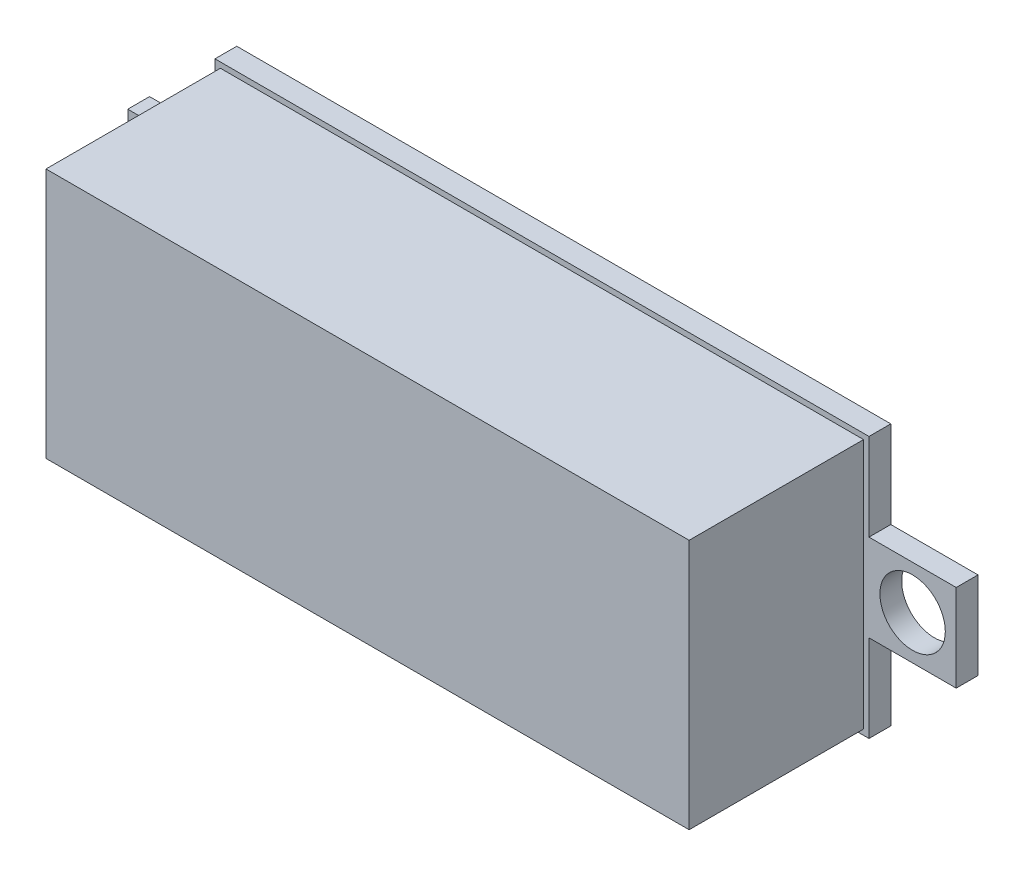
ISO-10303-21;
HEADER;
FILE_DESCRIPTION(('STEP AP214'),'2;1');
FILE_NAME('part.step','',(''),(''),'','','');
FILE_SCHEMA(('AUTOMOTIVE_DESIGN { 1 0 10303 214 1 1 1 1 }'));
ENDSEC;
DATA;
#1=APPLICATION_CONTEXT('core data for automotive mechanical design processes');
#2=APPLICATION_PROTOCOL_DEFINITION('international standard','automotive_design',2000,#1);
#3=PRODUCT_CONTEXT('',#1,'mechanical');
#4=PRODUCT('Part','Part','',(#3));
#5=PRODUCT_RELATED_PRODUCT_CATEGORY('part','',(#4));
#6=PRODUCT_DEFINITION_FORMATION('','',#4);
#7=PRODUCT_DEFINITION_CONTEXT('part definition',#1,'design');
#8=PRODUCT_DEFINITION('design','',#6,#7);
#9=PRODUCT_DEFINITION_SHAPE('','',#8);
#10=(LENGTH_UNIT() NAMED_UNIT(*) SI_UNIT(.MILLI.,.METRE.));
#11=(NAMED_UNIT(*) PLANE_ANGLE_UNIT() SI_UNIT($,.RADIAN.));
#12=(NAMED_UNIT(*) SI_UNIT($,.STERADIAN.) SOLID_ANGLE_UNIT());
#13=UNCERTAINTY_MEASURE_WITH_UNIT(LENGTH_MEASURE(1.E-05),#10,'distance_accuracy_value','');
#14=(GEOMETRIC_REPRESENTATION_CONTEXT(3) GLOBAL_UNCERTAINTY_ASSIGNED_CONTEXT((#13)) GLOBAL_UNIT_ASSIGNED_CONTEXT((#10,
#11,#12)) REPRESENTATION_CONTEXT('',''));
#15=CARTESIAN_POINT('',(0.,0.,0.));
#16=DIRECTION('',(0.,0.,1.));
#17=DIRECTION('',(1.,0.,0.));
#18=AXIS2_PLACEMENT_3D('',#15,#16,#17);
#19=CARTESIAN_POINT('',(0.,0.,1.));
#20=DIRECTION('',(0.,0.,1.));
#21=DIRECTION('',(1.,0.,0.));
#22=AXIS2_PLACEMENT_3D('',#19,#20,#21);
#23=PLANE('',#22);
#24=CARTESIAN_POINT('',(-2.,6.,1.));
#25=DIRECTION('',(0.,0.,1.));
#26=DIRECTION('',(1.,0.,0.));
#27=AXIS2_PLACEMENT_3D('',#24,#25,#26);
#28=CIRCLE('',#27,1.5);
#29=CARTESIAN_POINT('',(-0.499999999999998,6.,1.));
#30=VERTEX_POINT('',#29);
#31=EDGE_CURVE('E215',#30,#30,#28,.T.);
#32=ORIENTED_EDGE('',*,*,#31,.F.);
#33=EDGE_LOOP('',(#32));
#34=FACE_BOUND('',#33,.T.);
#35=DIRECTION('',(0.,-1.,0.));
#36=VECTOR('',#35,1.);
#37=CARTESIAN_POINT('',(-4.,0.,1.));
#38=LINE('',#37,#36);
#39=CARTESIAN_POINT('',(-4.,8.,1.));
#40=VERTEX_POINT('',#39);
#41=CARTESIAN_POINT('',(-4.,4.,1.));
#42=VERTEX_POINT('',#41);
#43=EDGE_CURVE('E268',#40,#42,#38,.T.);
#44=ORIENTED_EDGE('',*,*,#43,.T.);
#45=DIRECTION('',(1.,0.,0.));
#46=VECTOR('',#45,1.);
#47=CARTESIAN_POINT('',(0.,4.,1.));
#48=LINE('',#47,#46);
#49=CARTESIAN_POINT('',(0.,4.,1.));
#50=VERTEX_POINT('',#49);
#51=EDGE_CURVE('E113',#42,#50,#48,.T.);
#52=ORIENTED_EDGE('',*,*,#51,.T.);
#53=DIRECTION('',(0.,-1.,0.));
#54=VECTOR('',#53,1.);
#55=CARTESIAN_POINT('',(0.,0.,1.));
#56=LINE('',#55,#54);
#57=CARTESIAN_POINT('',(0.,0.,1.));
#58=VERTEX_POINT('',#57);
#59=EDGE_CURVE('E164',#50,#58,#56,.T.);
#60=ORIENTED_EDGE('',*,*,#59,.T.);
#61=DIRECTION('',(1.,0.,0.));
#62=VECTOR('',#61,1.);
#63=CARTESIAN_POINT('',(0.,0.,1.));
#64=LINE('',#63,#62);
#65=CARTESIAN_POINT('',(30.,0.,1.));
#66=VERTEX_POINT('',#65);
#67=EDGE_CURVE('E248',#58,#66,#64,.T.);
#68=ORIENTED_EDGE('',*,*,#67,.T.);
#69=DIRECTION('',(0.,-1.,0.));
#70=VECTOR('',#69,1.);
#71=CARTESIAN_POINT('',(30.,0.,1.));
#72=LINE('',#71,#70);
#73=CARTESIAN_POINT('',(30.,4.,1.));
#74=VERTEX_POINT('',#73);
#75=EDGE_CURVE('E173',#74,#66,#72,.T.);
#76=ORIENTED_EDGE('',*,*,#75,.F.);
#77=DIRECTION('',(1.,0.,0.));
#78=VECTOR('',#77,1.);
#79=CARTESIAN_POINT('',(0.,4.,1.));
#80=LINE('',#79,#78);
#81=CARTESIAN_POINT('',(34.,4.,1.));
#82=VERTEX_POINT('',#81);
#83=EDGE_CURVE('E251',#74,#82,#80,.T.);
#84=ORIENTED_EDGE('',*,*,#83,.T.);
#85=DIRECTION('',(0.,-1.,0.));
#86=VECTOR('',#85,1.);
#87=CARTESIAN_POINT('',(34.,0.,1.));
#88=LINE('',#87,#86);
#89=CARTESIAN_POINT('',(34.,8.,1.));
#90=VERTEX_POINT('',#89);
#91=EDGE_CURVE('E254',#90,#82,#88,.T.);
#92=ORIENTED_EDGE('',*,*,#91,.F.);
#93=DIRECTION('',(1.,0.,0.));
#94=VECTOR('',#93,1.);
#95=CARTESIAN_POINT('',(0.,8.,1.));
#96=LINE('',#95,#94);
#97=CARTESIAN_POINT('',(30.,8.,1.));
#98=VERTEX_POINT('',#97);
#99=EDGE_CURVE('E171',#98,#90,#96,.T.);
#100=ORIENTED_EDGE('',*,*,#99,.F.);
#101=CARTESIAN_POINT('',(30.,12.,1.));
#102=VERTEX_POINT('',#101);
#103=EDGE_CURVE('E169',#102,#98,#72,.T.);
#104=ORIENTED_EDGE('',*,*,#103,.F.);
#105=DIRECTION('',(1.,0.,0.));
#106=VECTOR('',#105,1.);
#107=CARTESIAN_POINT('',(0.,12.,1.));
#108=LINE('',#107,#106);
#109=CARTESIAN_POINT('',(0.,12.,1.));
#110=VERTEX_POINT('',#109);
#111=EDGE_CURVE('E148',#110,#102,#108,.T.);
#112=ORIENTED_EDGE('',*,*,#111,.F.);
#113=CARTESIAN_POINT('',(0.,8.,1.));
#114=VERTEX_POINT('',#113);
#115=EDGE_CURVE('E158',#110,#114,#56,.T.);
#116=ORIENTED_EDGE('',*,*,#115,.T.);
#117=DIRECTION('',(1.,0.,0.));
#118=VECTOR('',#117,1.);
#119=CARTESIAN_POINT('',(0.,8.,1.));
#120=LINE('',#119,#118);
#121=EDGE_CURVE('E162',#40,#114,#120,.T.);
#122=ORIENTED_EDGE('',*,*,#121,.F.);
#123=EDGE_LOOP('',(#44,#52,#60,#68,#76,#84,#92,#100,#104,#112,#116,#122));
#124=FACE_BOUND('',#123,.T.);
#125=CARTESIAN_POINT('',(32.,6.,1.));
#126=DIRECTION('',(0.,0.,1.));
#127=DIRECTION('',(1.,0.,0.));
#128=AXIS2_PLACEMENT_3D('',#125,#126,#127);
#129=CIRCLE('',#128,1.5);
#130=CARTESIAN_POINT('',(33.5,6.,1.));
#131=VERTEX_POINT('',#130);
#132=EDGE_CURVE('E178',#131,#131,#129,.T.);
#133=ORIENTED_EDGE('',*,*,#132,.F.);
#134=EDGE_LOOP('',(#133));
#135=FACE_BOUND('',#134,.T.);
#136=DIRECTION('',(1.,0.,0.));
#137=VECTOR('',#136,1.);
#138=CARTESIAN_POINT('',(0.250000000000001,0.25,1.));
#139=LINE('',#138,#137);
#140=CARTESIAN_POINT('',(0.250000000000001,0.25,1.));
#141=VERTEX_POINT('',#140);
#142=CARTESIAN_POINT('',(29.75,0.25,1.));
#143=VERTEX_POINT('',#142);
#144=EDGE_CURVE('E565',#141,#143,#139,.T.);
#145=ORIENTED_EDGE('',*,*,#144,.F.);
#146=DIRECTION('',(0.,-1.,0.));
#147=VECTOR('',#146,1.);
#148=CARTESIAN_POINT('',(0.25,11.75,1.));
#149=LINE('',#148,#147);
#150=CARTESIAN_POINT('',(0.25,11.75,1.));
#151=VERTEX_POINT('',#150);
#152=EDGE_CURVE('E547',#151,#141,#149,.T.);
#153=ORIENTED_EDGE('',*,*,#152,.F.);
#154=DIRECTION('',(-1.,0.,0.));
#155=VECTOR('',#154,1.);
#156=CARTESIAN_POINT('',(0.25,11.75,1.));
#157=LINE('',#156,#155);
#158=CARTESIAN_POINT('',(29.75,11.75,1.));
#159=VERTEX_POINT('',#158);
#160=EDGE_CURVE('E541',#159,#151,#157,.T.);
#161=ORIENTED_EDGE('',*,*,#160,.F.);
#162=DIRECTION('',(0.,1.,0.));
#163=VECTOR('',#162,1.);
#164=CARTESIAN_POINT('',(29.75,11.75,1.));
#165=LINE('',#164,#163);
#166=EDGE_CURVE('E563',#143,#159,#165,.T.);
#167=ORIENTED_EDGE('',*,*,#166,.F.);
#168=EDGE_LOOP('',(#145,#153,#161,#167));
#169=FACE_BOUND('',#168,.T.);
#170=ADVANCED_FACE('F38',(#34,#124,#135,#169),#23,.T.);
#171=CARTESIAN_POINT('',(-4.,0.,1.));
#172=DIRECTION('',(1.,0.,0.));
#173=DIRECTION('',(0.,0.,-1.));
#174=AXIS2_PLACEMENT_3D('',#171,#172,#173);
#175=PLANE('',#174);
#176=DIRECTION('',(0.,-1.,0.));
#177=VECTOR('',#176,1.);
#178=CARTESIAN_POINT('',(-4.,0.,0.));
#179=LINE('',#178,#177);
#180=CARTESIAN_POINT('',(-4.,8.,0.));
#181=VERTEX_POINT('',#180);
#182=CARTESIAN_POINT('',(-4.,4.,0.));
#183=VERTEX_POINT('',#182);
#184=EDGE_CURVE('E184',#181,#183,#179,.T.);
#185=ORIENTED_EDGE('',*,*,#184,.T.);
#186=DIRECTION('',(0.,0.,-1.));
#187=VECTOR('',#186,1.);
#188=CARTESIAN_POINT('',(-4.,4.,1.));
#189=LINE('',#188,#187);
#190=EDGE_CURVE('E11',#42,#183,#189,.T.);
#191=ORIENTED_EDGE('',*,*,#190,.F.);
#192=ORIENTED_EDGE('',*,*,#43,.F.);
#193=DIRECTION('',(0.,0.,-1.));
#194=VECTOR('',#193,1.);
#195=CARTESIAN_POINT('',(-4.,8.,1.));
#196=LINE('',#195,#194);
#197=EDGE_CURVE('E62',#40,#181,#196,.T.);
#198=ORIENTED_EDGE('',*,*,#197,.T.);
#199=EDGE_LOOP('',(#185,#191,#192,#198));
#200=FACE_BOUND('',#199,.T.);
#201=ADVANCED_FACE('F271',(#200),#175,.F.);
#202=CARTESIAN_POINT('',(0.,4.,1.));
#203=DIRECTION('',(0.,1.,0.));
#204=DIRECTION('',(0.,0.,1.));
#205=AXIS2_PLACEMENT_3D('',#202,#203,#204);
#206=PLANE('',#205);
#207=DIRECTION('',(1.,0.,0.));
#208=VECTOR('',#207,1.);
#209=CARTESIAN_POINT('',(0.,4.,0.));
#210=LINE('',#209,#208);
#211=CARTESIAN_POINT('',(0.,4.,0.));
#212=VERTEX_POINT('',#211);
#213=EDGE_CURVE('E187',#183,#212,#210,.T.);
#214=ORIENTED_EDGE('',*,*,#213,.T.);
#215=DIRECTION('',(0.,0.,-1.));
#216=VECTOR('',#215,1.);
#217=CARTESIAN_POINT('',(0.,4.,1.));
#218=LINE('',#217,#216);
#219=EDGE_CURVE('E46',#50,#212,#218,.T.);
#220=ORIENTED_EDGE('',*,*,#219,.F.);
#221=ORIENTED_EDGE('',*,*,#51,.F.);
#222=ORIENTED_EDGE('',*,*,#190,.T.);
#223=EDGE_LOOP('',(#214,#220,#221,#222));
#224=FACE_BOUND('',#223,.T.);
#225=ADVANCED_FACE('F272',(#224),#206,.F.);
#226=CARTESIAN_POINT('',(0.,0.,1.));
#227=DIRECTION('',(1.,0.,0.));
#228=DIRECTION('',(0.,0.,-1.));
#229=AXIS2_PLACEMENT_3D('',#226,#227,#228);
#230=PLANE('',#229);
#231=DIRECTION('',(0.,-1.,0.));
#232=VECTOR('',#231,1.);
#233=CARTESIAN_POINT('',(0.,0.,0.));
#234=LINE('',#233,#232);
#235=CARTESIAN_POINT('',(0.,0.,0.));
#236=VERTEX_POINT('',#235);
#237=EDGE_CURVE('E189',#212,#236,#234,.T.);
#238=ORIENTED_EDGE('',*,*,#237,.T.);
#239=DIRECTION('',(0.,0.,-1.));
#240=VECTOR('',#239,1.);
#241=CARTESIAN_POINT('',(0.,0.,1.));
#242=LINE('',#241,#240);
#243=EDGE_CURVE('E229',#58,#236,#242,.T.);
#244=ORIENTED_EDGE('',*,*,#243,.F.);
#245=ORIENTED_EDGE('',*,*,#59,.F.);
#246=ORIENTED_EDGE('',*,*,#219,.T.);
#247=EDGE_LOOP('',(#238,#244,#245,#246));
#248=FACE_BOUND('',#247,.T.);
#249=ADVANCED_FACE('F235',(#248),#230,.F.);
#250=CARTESIAN_POINT('',(0.,0.,1.));
#251=DIRECTION('',(0.,1.,0.));
#252=DIRECTION('',(0.,0.,1.));
#253=AXIS2_PLACEMENT_3D('',#250,#251,#252);
#254=PLANE('',#253);
#255=DIRECTION('',(1.,0.,0.));
#256=VECTOR('',#255,1.);
#257=CARTESIAN_POINT('',(0.,0.,0.));
#258=LINE('',#257,#256);
#259=CARTESIAN_POINT('',(30.,0.,0.));
#260=VERTEX_POINT('',#259);
#261=EDGE_CURVE('E191',#236,#260,#258,.T.);
#262=ORIENTED_EDGE('',*,*,#261,.T.);
#263=DIRECTION('',(0.,0.,-1.));
#264=VECTOR('',#263,1.);
#265=CARTESIAN_POINT('',(30.,0.,1.));
#266=LINE('',#265,#264);
#267=EDGE_CURVE('E227',#66,#260,#266,.T.);
#268=ORIENTED_EDGE('',*,*,#267,.F.);
#269=ORIENTED_EDGE('',*,*,#67,.F.);
#270=ORIENTED_EDGE('',*,*,#243,.T.);
#271=EDGE_LOOP('',(#262,#268,#269,#270));
#272=FACE_BOUND('',#271,.T.);
#273=ADVANCED_FACE('F245',(#272),#254,.F.);
#274=CARTESIAN_POINT('',(30.,0.,1.));
#275=DIRECTION('',(1.,0.,0.));
#276=DIRECTION('',(0.,0.,-1.));
#277=AXIS2_PLACEMENT_3D('',#274,#275,#276);
#278=PLANE('',#277);
#279=DIRECTION('',(0.,-1.,0.));
#280=VECTOR('',#279,1.);
#281=CARTESIAN_POINT('',(30.,0.,0.));
#282=LINE('',#281,#280);
#283=CARTESIAN_POINT('',(30.,4.,0.));
#284=VERTEX_POINT('',#283);
#285=EDGE_CURVE('E195',#284,#260,#282,.T.);
#286=ORIENTED_EDGE('',*,*,#285,.F.);
#287=DIRECTION('',(0.,0.,-1.));
#288=VECTOR('',#287,1.);
#289=CARTESIAN_POINT('',(30.,4.,1.));
#290=LINE('',#289,#288);
#291=EDGE_CURVE('E225',#74,#284,#290,.T.);
#292=ORIENTED_EDGE('',*,*,#291,.F.);
#293=ORIENTED_EDGE('',*,*,#75,.T.);
#294=ORIENTED_EDGE('',*,*,#267,.T.);
#295=EDGE_LOOP('',(#286,#292,#293,#294));
#296=FACE_BOUND('',#295,.T.);
#297=ADVANCED_FACE('F305',(#296),#278,.T.);
#298=CARTESIAN_POINT('',(0.,4.,1.));
#299=DIRECTION('',(0.,1.,0.));
#300=DIRECTION('',(0.,0.,1.));
#301=AXIS2_PLACEMENT_3D('',#298,#299,#300);
#302=PLANE('',#301);
#303=DIRECTION('',(1.,0.,0.));
#304=VECTOR('',#303,1.);
#305=CARTESIAN_POINT('',(0.,4.,0.));
#306=LINE('',#305,#304);
#307=CARTESIAN_POINT('',(34.,4.,0.));
#308=VERTEX_POINT('',#307);
#309=EDGE_CURVE('E198',#284,#308,#306,.T.);
#310=ORIENTED_EDGE('',*,*,#309,.T.);
#311=DIRECTION('',(0.,0.,-1.));
#312=VECTOR('',#311,1.);
#313=CARTESIAN_POINT('',(34.,4.,1.));
#314=LINE('',#313,#312);
#315=EDGE_CURVE('E223',#82,#308,#314,.T.);
#316=ORIENTED_EDGE('',*,*,#315,.F.);
#317=ORIENTED_EDGE('',*,*,#83,.F.);
#318=ORIENTED_EDGE('',*,*,#291,.T.);
#319=EDGE_LOOP('',(#310,#316,#317,#318));
#320=FACE_BOUND('',#319,.T.);
#321=ADVANCED_FACE('F311',(#320),#302,.F.);
#322=CARTESIAN_POINT('',(34.,0.,1.));
#323=DIRECTION('',(1.,0.,0.));
#324=DIRECTION('',(0.,0.,-1.));
#325=AXIS2_PLACEMENT_3D('',#322,#323,#324);
#326=PLANE('',#325);
#327=DIRECTION('',(0.,-1.,0.));
#328=VECTOR('',#327,1.);
#329=CARTESIAN_POINT('',(34.,0.,0.));
#330=LINE('',#329,#328);
#331=CARTESIAN_POINT('',(34.,8.,0.));
#332=VERTEX_POINT('',#331);
#333=EDGE_CURVE('E202',#332,#308,#330,.T.);
#334=ORIENTED_EDGE('',*,*,#333,.F.);
#335=DIRECTION('',(0.,0.,-1.));
#336=VECTOR('',#335,1.);
#337=CARTESIAN_POINT('',(34.,8.,1.));
#338=LINE('',#337,#336);
#339=EDGE_CURVE('E221',#90,#332,#338,.T.);
#340=ORIENTED_EDGE('',*,*,#339,.F.);
#341=ORIENTED_EDGE('',*,*,#91,.T.);
#342=ORIENTED_EDGE('',*,*,#315,.T.);
#343=EDGE_LOOP('',(#334,#340,#341,#342));
#344=FACE_BOUND('',#343,.T.);
#345=ADVANCED_FACE('F308',(#344),#326,.T.);
#346=CARTESIAN_POINT('',(0.,8.,1.));
#347=DIRECTION('',(0.,1.,0.));
#348=DIRECTION('',(0.,0.,1.));
#349=AXIS2_PLACEMENT_3D('',#346,#347,#348);
#350=PLANE('',#349);
#351=DIRECTION('',(1.,0.,0.));
#352=VECTOR('',#351,1.);
#353=CARTESIAN_POINT('',(0.,8.,0.));
#354=LINE('',#353,#352);
#355=CARTESIAN_POINT('',(30.,8.,0.));
#356=VERTEX_POINT('',#355);
#357=EDGE_CURVE('E205',#356,#332,#354,.T.);
#358=ORIENTED_EDGE('',*,*,#357,.F.);
#359=DIRECTION('',(0.,0.,-1.));
#360=VECTOR('',#359,1.);
#361=CARTESIAN_POINT('',(30.,8.,1.));
#362=LINE('',#361,#360);
#363=EDGE_CURVE('E219',#98,#356,#362,.T.);
#364=ORIENTED_EDGE('',*,*,#363,.F.);
#365=ORIENTED_EDGE('',*,*,#99,.T.);
#366=ORIENTED_EDGE('',*,*,#339,.T.);
#367=EDGE_LOOP('',(#358,#364,#365,#366));
#368=FACE_BOUND('',#367,.T.);
#369=ADVANCED_FACE('F261',(#368),#350,.T.);
#370=CARTESIAN_POINT('',(30.,12.,0.));
#371=VERTEX_POINT('',#370);
#372=EDGE_CURVE('E199',#371,#356,#282,.T.);
#373=ORIENTED_EDGE('',*,*,#372,.F.);
#374=DIRECTION('',(0.,0.,-1.));
#375=VECTOR('',#374,1.);
#376=CARTESIAN_POINT('',(30.,12.,1.));
#377=LINE('',#376,#375);
#378=EDGE_CURVE('E154',#102,#371,#377,.T.);
#379=ORIENTED_EDGE('',*,*,#378,.F.);
#380=ORIENTED_EDGE('',*,*,#103,.T.);
#381=ORIENTED_EDGE('',*,*,#363,.T.);
#382=EDGE_LOOP('',(#373,#379,#380,#381));
#383=FACE_BOUND('',#382,.T.);
#384=ADVANCED_FACE('F265',(#383),#278,.T.);
#385=CARTESIAN_POINT('',(0.,12.,1.));
#386=DIRECTION('',(0.,1.,0.));
#387=DIRECTION('',(0.,0.,1.));
#388=AXIS2_PLACEMENT_3D('',#385,#386,#387);
#389=PLANE('',#388);
#390=DIRECTION('',(1.,0.,0.));
#391=VECTOR('',#390,1.);
#392=CARTESIAN_POINT('',(0.,12.,0.));
#393=LINE('',#392,#391);
#394=CARTESIAN_POINT('',(0.,12.,0.));
#395=VERTEX_POINT('',#394);
#396=EDGE_CURVE('E150',#395,#371,#393,.T.);
#397=ORIENTED_EDGE('',*,*,#396,.F.);
#398=DIRECTION('',(0.,0.,-1.));
#399=VECTOR('',#398,1.);
#400=CARTESIAN_POINT('',(0.,12.,1.));
#401=LINE('',#400,#399);
#402=EDGE_CURVE('E144',#110,#395,#401,.T.);
#403=ORIENTED_EDGE('',*,*,#402,.F.);
#404=ORIENTED_EDGE('',*,*,#111,.T.);
#405=ORIENTED_EDGE('',*,*,#378,.T.);
#406=EDGE_LOOP('',(#397,#403,#404,#405));
#407=FACE_BOUND('',#406,.T.);
#408=ADVANCED_FACE('F146',(#407),#389,.T.);
#409=CARTESIAN_POINT('',(0.,8.,0.));
#410=VERTEX_POINT('',#409);
#411=EDGE_CURVE('E192',#395,#410,#234,.T.);
#412=ORIENTED_EDGE('',*,*,#411,.T.);
#413=DIRECTION('',(0.,0.,-1.));
#414=VECTOR('',#413,1.);
#415=CARTESIAN_POINT('',(0.,8.,1.));
#416=LINE('',#415,#414);
#417=EDGE_CURVE('E155',#114,#410,#416,.T.);
#418=ORIENTED_EDGE('',*,*,#417,.F.);
#419=ORIENTED_EDGE('',*,*,#115,.F.);
#420=ORIENTED_EDGE('',*,*,#402,.T.);
#421=EDGE_LOOP('',(#412,#418,#419,#420));
#422=FACE_BOUND('',#421,.T.);
#423=ADVANCED_FACE('F159',(#422),#230,.F.);
#424=CARTESIAN_POINT('',(0.,8.,1.));
#425=DIRECTION('',(0.,1.,0.));
#426=DIRECTION('',(0.,0.,1.));
#427=AXIS2_PLACEMENT_3D('',#424,#425,#426);
#428=PLANE('',#427);
#429=DIRECTION('',(1.,0.,0.));
#430=VECTOR('',#429,1.);
#431=CARTESIAN_POINT('',(0.,8.,0.));
#432=LINE('',#431,#430);
#433=EDGE_CURVE('E209',#181,#410,#432,.T.);
#434=ORIENTED_EDGE('',*,*,#433,.F.);
#435=ORIENTED_EDGE('',*,*,#197,.F.);
#436=ORIENTED_EDGE('',*,*,#121,.T.);
#437=ORIENTED_EDGE('',*,*,#417,.T.);
#438=EDGE_LOOP('',(#434,#435,#436,#437));
#439=FACE_BOUND('',#438,.T.);
#440=ADVANCED_FACE('F267',(#439),#428,.T.);
#441=CARTESIAN_POINT('',(-2.,6.,1.));
#442=DIRECTION('',(0.,0.,-1.));
#443=DIRECTION('',(-1.,0.,0.));
#444=AXIS2_PLACEMENT_3D('',#441,#442,#443);
#445=CYLINDRICAL_SURFACE('',#444,1.5);
#446=ORIENTED_EDGE('',*,*,#31,.T.);
#447=EDGE_LOOP('',(#446));
#448=FACE_BOUND('',#447,.T.);
#449=CARTESIAN_POINT('',(-2.,6.,0.));
#450=DIRECTION('',(0.,0.,1.));
#451=DIRECTION('',(1.,0.,0.));
#452=AXIS2_PLACEMENT_3D('',#449,#450,#451);
#453=CIRCLE('',#452,1.5);
#454=CARTESIAN_POINT('',(-0.499999999999998,6.,0.));
#455=VERTEX_POINT('',#454);
#456=EDGE_CURVE('E181',#455,#455,#453,.T.);
#457=ORIENTED_EDGE('',*,*,#456,.F.);
#458=EDGE_LOOP('',(#457));
#459=FACE_BOUND('',#458,.T.);
#460=ADVANCED_FACE('F40',(#448,#459),#445,.F.);
#461=CARTESIAN_POINT('',(32.,6.,1.));
#462=DIRECTION('',(0.,0.,-1.));
#463=DIRECTION('',(-1.,0.,0.));
#464=AXIS2_PLACEMENT_3D('',#461,#462,#463);
#465=CYLINDRICAL_SURFACE('',#464,1.5);
#466=ORIENTED_EDGE('',*,*,#132,.T.);
#467=EDGE_LOOP('',(#466));
#468=FACE_BOUND('',#467,.T.);
#469=CARTESIAN_POINT('',(32.,6.,0.));
#470=DIRECTION('',(0.,0.,1.));
#471=DIRECTION('',(1.,0.,0.));
#472=AXIS2_PLACEMENT_3D('',#469,#470,#471);
#473=CIRCLE('',#472,1.5);
#474=CARTESIAN_POINT('',(33.5,6.,0.));
#475=VERTEX_POINT('',#474);
#476=EDGE_CURVE('E212',#475,#475,#473,.T.);
#477=ORIENTED_EDGE('',*,*,#476,.F.);
#478=EDGE_LOOP('',(#477));
#479=FACE_BOUND('',#478,.T.);
#480=ADVANCED_FACE('F293',(#468,#479),#465,.F.);
#481=CARTESIAN_POINT('',(0.,0.,0.));
#482=DIRECTION('',(0.,0.,1.));
#483=DIRECTION('',(1.,0.,0.));
#484=AXIS2_PLACEMENT_3D('',#481,#482,#483);
#485=PLANE('',#484);
#486=ORIENTED_EDGE('',*,*,#456,.T.);
#487=EDGE_LOOP('',(#486));
#488=FACE_BOUND('',#487,.T.);
#489=ORIENTED_EDGE('',*,*,#184,.F.);
#490=ORIENTED_EDGE('',*,*,#433,.T.);
#491=ORIENTED_EDGE('',*,*,#411,.F.);
#492=ORIENTED_EDGE('',*,*,#396,.T.);
#493=ORIENTED_EDGE('',*,*,#372,.T.);
#494=ORIENTED_EDGE('',*,*,#357,.T.);
#495=ORIENTED_EDGE('',*,*,#333,.T.);
#496=ORIENTED_EDGE('',*,*,#309,.F.);
#497=ORIENTED_EDGE('',*,*,#285,.T.);
#498=ORIENTED_EDGE('',*,*,#261,.F.);
#499=ORIENTED_EDGE('',*,*,#237,.F.);
#500=ORIENTED_EDGE('',*,*,#213,.F.);
#501=EDGE_LOOP('',(#489,#490,#491,#492,#493,#494,#495,#496,#497,#498,#499,#500));
#502=FACE_BOUND('',#501,.T.);
#503=ORIENTED_EDGE('',*,*,#476,.T.);
#504=EDGE_LOOP('',(#503));
#505=FACE_BOUND('',#504,.T.);
#506=ADVANCED_FACE('F239',(#488,#502,#505),#485,.F.);
#507=CARTESIAN_POINT('',(0.25,11.75,9.));
#508=DIRECTION('',(1.,0.,0.));
#509=DIRECTION('',(0.,1.,0.));
#510=AXIS2_PLACEMENT_3D('',#507,#508,#509);
#511=PLANE('',#510);
#512=ORIENTED_EDGE('',*,*,#152,.T.);
#513=DIRECTION('',(0.,0.,-1.));
#514=VECTOR('',#513,1.);
#515=CARTESIAN_POINT('',(0.250000000000001,0.25,9.));
#516=LINE('',#515,#514);
#517=CARTESIAN_POINT('',(0.250000000000001,0.25,9.));
#518=VERTEX_POINT('',#517);
#519=EDGE_CURVE('E185',#518,#141,#516,.T.);
#520=ORIENTED_EDGE('',*,*,#519,.F.);
#521=DIRECTION('',(0.,-1.,0.));
#522=VECTOR('',#521,1.);
#523=CARTESIAN_POINT('',(0.25,11.75,9.));
#524=LINE('',#523,#522);
#525=CARTESIAN_POINT('',(0.25,11.75,9.));
#526=VERTEX_POINT('',#525);
#527=EDGE_CURVE('E530',#526,#518,#524,.T.);
#528=ORIENTED_EDGE('',*,*,#527,.F.);
#529=DIRECTION('',(0.,0.,-1.));
#530=VECTOR('',#529,1.);
#531=CARTESIAN_POINT('',(0.25,11.75,9.));
#532=LINE('',#531,#530);
#533=EDGE_CURVE('E560',#526,#151,#532,.T.);
#534=ORIENTED_EDGE('',*,*,#533,.T.);
#535=EDGE_LOOP('',(#512,#520,#528,#534));
#536=FACE_BOUND('',#535,.T.);
#537=ADVANCED_FACE('F289',(#536),#511,.F.);
#538=CARTESIAN_POINT('',(0.250000000000001,0.25,9.));
#539=DIRECTION('',(0.,1.,0.));
#540=DIRECTION('',(0.,0.,1.));
#541=AXIS2_PLACEMENT_3D('',#538,#539,#540);
#542=PLANE('',#541);
#543=ORIENTED_EDGE('',*,*,#144,.T.);
#544=DIRECTION('',(0.,0.,-1.));
#545=VECTOR('',#544,1.);
#546=CARTESIAN_POINT('',(29.75,0.25,9.));
#547=LINE('',#546,#545);
#548=CARTESIAN_POINT('',(29.75,0.25,9.));
#549=VERTEX_POINT('',#548);
#550=EDGE_CURVE('E550',#549,#143,#547,.T.);
#551=ORIENTED_EDGE('',*,*,#550,.F.);
#552=DIRECTION('',(1.,0.,0.));
#553=VECTOR('',#552,1.);
#554=CARTESIAN_POINT('',(0.250000000000001,0.25,9.));
#555=LINE('',#554,#553);
#556=EDGE_CURVE('E535',#518,#549,#555,.T.);
#557=ORIENTED_EDGE('',*,*,#556,.F.);
#558=ORIENTED_EDGE('',*,*,#519,.T.);
#559=EDGE_LOOP('',(#543,#551,#557,#558));
#560=FACE_BOUND('',#559,.T.);
#561=ADVANCED_FACE('F371',(#560),#542,.F.);
#562=CARTESIAN_POINT('',(29.75,11.75,9.));
#563=DIRECTION('',(-1.,0.,0.));
#564=DIRECTION('',(0.,0.,1.));
#565=AXIS2_PLACEMENT_3D('',#562,#563,#564);
#566=PLANE('',#565);
#567=ORIENTED_EDGE('',*,*,#166,.T.);
#568=DIRECTION('',(0.,0.,-1.));
#569=VECTOR('',#568,1.);
#570=CARTESIAN_POINT('',(29.75,11.75,9.));
#571=LINE('',#570,#569);
#572=CARTESIAN_POINT('',(29.75,11.75,9.));
#573=VERTEX_POINT('',#572);
#574=EDGE_CURVE('E53',#573,#159,#571,.T.);
#575=ORIENTED_EDGE('',*,*,#574,.F.);
#576=DIRECTION('',(0.,1.,0.));
#577=VECTOR('',#576,1.);
#578=CARTESIAN_POINT('',(29.75,11.75,9.));
#579=LINE('',#578,#577);
#580=EDGE_CURVE('E569',#549,#573,#579,.T.);
#581=ORIENTED_EDGE('',*,*,#580,.F.);
#582=ORIENTED_EDGE('',*,*,#550,.T.);
#583=EDGE_LOOP('',(#567,#575,#581,#582));
#584=FACE_BOUND('',#583,.T.);
#585=ADVANCED_FACE('F378',(#584),#566,.F.);
#586=CARTESIAN_POINT('',(0.25,11.75,9.));
#587=DIRECTION('',(0.,-1.,0.));
#588=DIRECTION('',(0.,0.,-1.));
#589=AXIS2_PLACEMENT_3D('',#586,#587,#588);
#590=PLANE('',#589);
#591=ORIENTED_EDGE('',*,*,#160,.T.);
#592=ORIENTED_EDGE('',*,*,#533,.F.);
#593=DIRECTION('',(-1.,0.,0.));
#594=VECTOR('',#593,1.);
#595=CARTESIAN_POINT('',(0.25,11.75,9.));
#596=LINE('',#595,#594);
#597=EDGE_CURVE('E537',#573,#526,#596,.T.);
#598=ORIENTED_EDGE('',*,*,#597,.F.);
#599=ORIENTED_EDGE('',*,*,#574,.T.);
#600=EDGE_LOOP('',(#591,#592,#598,#599));
#601=FACE_BOUND('',#600,.T.);
#602=ADVANCED_FACE('F385',(#601),#590,.F.);
#603=CARTESIAN_POINT('',(0.,0.,9.));
#604=DIRECTION('',(0.,0.,1.));
#605=DIRECTION('',(1.,0.,0.));
#606=AXIS2_PLACEMENT_3D('',#603,#604,#605);
#607=PLANE('',#606);
#608=ORIENTED_EDGE('',*,*,#527,.T.);
#609=ORIENTED_EDGE('',*,*,#556,.T.);
#610=ORIENTED_EDGE('',*,*,#580,.T.);
#611=ORIENTED_EDGE('',*,*,#597,.T.);
#612=EDGE_LOOP('',(#608,#609,#610,#611));
#613=FACE_BOUND('',#612,.T.);
#614=ADVANCED_FACE('F393',(#613),#607,.T.);
#615=CLOSED_SHELL('',(#170,#201,#225,#249,#273,#297,#321,#345,#369,#384,#408,#423,#440,#460,
#480,#506,#537,#561,#585,#602,#614));
#616=MANIFOLD_SOLID_BREP('B2',#615);
#617=ADVANCED_BREP_SHAPE_REPRESENTATION('',(#18,#616),#14);
#618=SHAPE_DEFINITION_REPRESENTATION(#9,#617);
ENDSEC;
END-ISO-10303-21;
